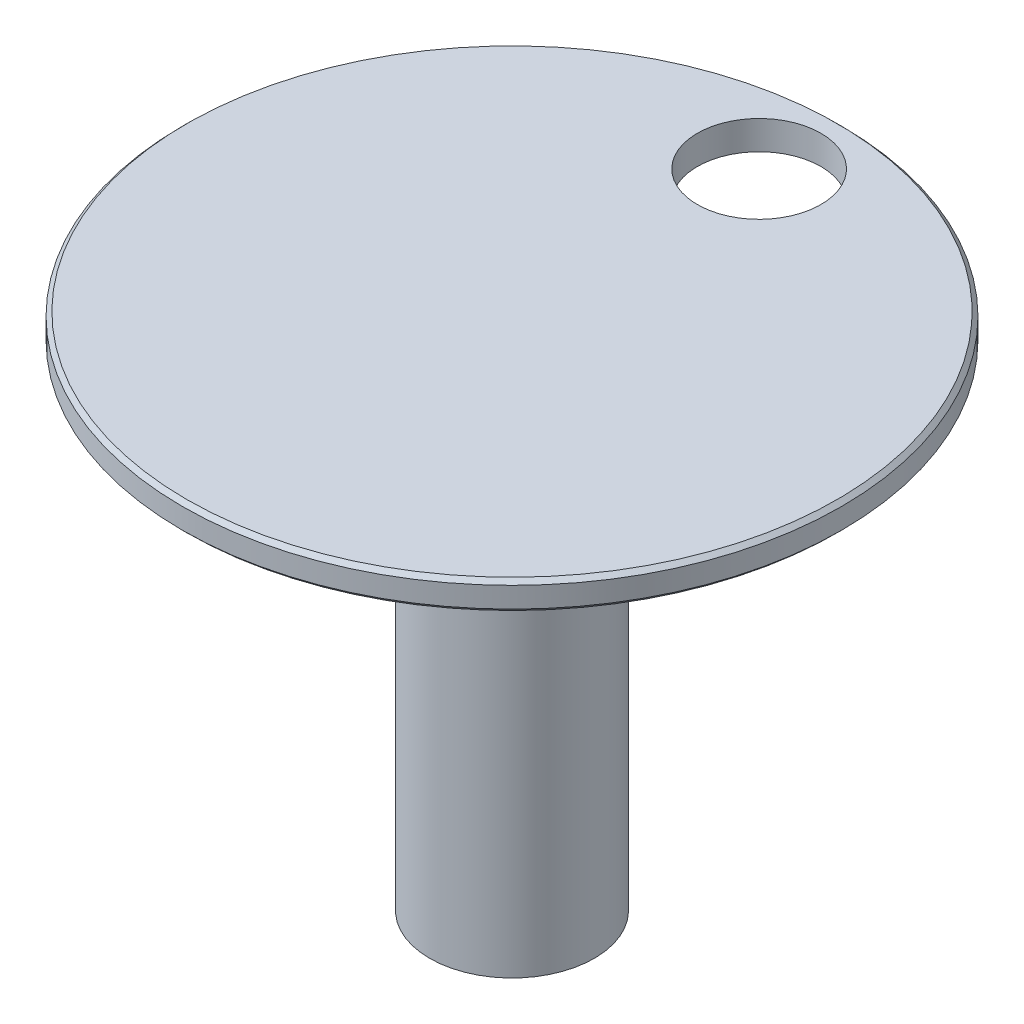
ISO-10303-21;
HEADER;
FILE_DESCRIPTION(('STEP AP214'),'2;1');
FILE_NAME('part.step','',(''),(''),'','','');
FILE_SCHEMA(('AUTOMOTIVE_DESIGN { 1 0 10303 214 1 1 1 1 }'));
ENDSEC;
DATA;
#1=APPLICATION_CONTEXT('core data for automotive mechanical design processes');
#2=APPLICATION_PROTOCOL_DEFINITION('international standard','automotive_design',2000,#1);
#3=PRODUCT_CONTEXT('',#1,'mechanical');
#4=PRODUCT('Part','Part','',(#3));
#5=PRODUCT_RELATED_PRODUCT_CATEGORY('part','',(#4));
#6=PRODUCT_DEFINITION_FORMATION('','',#4);
#7=PRODUCT_DEFINITION_CONTEXT('part definition',#1,'design');
#8=PRODUCT_DEFINITION('design','',#6,#7);
#9=PRODUCT_DEFINITION_SHAPE('','',#8);
#10=(LENGTH_UNIT() NAMED_UNIT(*) SI_UNIT(.MILLI.,.METRE.));
#11=(NAMED_UNIT(*) PLANE_ANGLE_UNIT() SI_UNIT($,.RADIAN.));
#12=(NAMED_UNIT(*) SI_UNIT($,.STERADIAN.) SOLID_ANGLE_UNIT());
#13=UNCERTAINTY_MEASURE_WITH_UNIT(LENGTH_MEASURE(1.E-05),#10,'distance_accuracy_value','');
#14=(GEOMETRIC_REPRESENTATION_CONTEXT(3) GLOBAL_UNCERTAINTY_ASSIGNED_CONTEXT((#13)) GLOBAL_UNIT_ASSIGNED_CONTEXT((#10,
#11,#12)) REPRESENTATION_CONTEXT('',''));
#15=CARTESIAN_POINT('',(0.,0.,0.));
#16=DIRECTION('',(0.,0.,1.));
#17=DIRECTION('',(1.,0.,0.));
#18=AXIS2_PLACEMENT_3D('',#15,#16,#17);
#19=CARTESIAN_POINT('',(0.,11.6,0.));
#20=DIRECTION('',(0.,-1.,0.));
#21=DIRECTION('',(0.,0.,-1.));
#22=AXIS2_PLACEMENT_3D('',#19,#20,#21);
#23=CYLINDRICAL_SURFACE('',#22,2.);
#24=CARTESIAN_POINT('',(0.,11.6,0.));
#25=DIRECTION('',(0.,1.,0.));
#26=DIRECTION('',(0.,0.,1.));
#27=AXIS2_PLACEMENT_3D('',#24,#25,#26);
#28=CIRCLE('',#27,2.);
#29=CARTESIAN_POINT('',(0.,11.6,2.));
#30=VERTEX_POINT('',#29);
#31=EDGE_CURVE('E54',#30,#30,#28,.T.);
#32=ORIENTED_EDGE('',*,*,#31,.F.);
#33=EDGE_LOOP('',(#32));
#34=FACE_BOUND('',#33,.T.);
#35=CARTESIAN_POINT('',(0.,0.,0.));
#36=DIRECTION('',(0.,1.,0.));
#37=DIRECTION('',(0.,0.,1.));
#38=AXIS2_PLACEMENT_3D('',#35,#36,#37);
#39=CIRCLE('',#38,2.);
#40=CARTESIAN_POINT('',(0.,0.,2.));
#41=VERTEX_POINT('',#40);
#42=EDGE_CURVE('E55',#41,#41,#39,.T.);
#43=ORIENTED_EDGE('',*,*,#42,.T.);
#44=EDGE_LOOP('',(#43));
#45=FACE_BOUND('',#44,.T.);
#46=ADVANCED_FACE('F33',(#34,#45),#23,.T.);
#47=CARTESIAN_POINT('',(0.,0.,0.));
#48=DIRECTION('',(0.,1.,0.));
#49=DIRECTION('',(0.,0.,1.));
#50=AXIS2_PLACEMENT_3D('',#47,#48,#49);
#51=PLANE('',#50);
#52=CARTESIAN_POINT('',(0.,0.,0.));
#53=DIRECTION('',(0.,-1.,0.));
#54=DIRECTION('',(0.,0.,-1.));
#55=AXIS2_PLACEMENT_3D('',#52,#53,#54);
#56=CIRCLE('',#55,1.5);
#57=CARTESIAN_POINT('',(0.,0.,-1.5));
#58=VERTEX_POINT('',#57);
#59=EDGE_CURVE('E67',#58,#58,#56,.T.);
#60=ORIENTED_EDGE('',*,*,#59,.F.);
#61=EDGE_LOOP('',(#60));
#62=FACE_BOUND('',#61,.T.);
#63=ORIENTED_EDGE('',*,*,#42,.F.);
#64=EDGE_LOOP('',(#63));
#65=FACE_BOUND('',#64,.T.);
#66=ADVANCED_FACE('F100',(#62,#65),#51,.F.);
#67=CARTESIAN_POINT('',(0.,11.9,0.));
#68=DIRECTION('',(0.,-1.,0.));
#69=DIRECTION('',(0.,0.,-1.));
#70=AXIS2_PLACEMENT_3D('',#67,#68,#69);
#71=CYLINDRICAL_SURFACE('',#70,4.);
#72=CARTESIAN_POINT('',(0.,11.9,0.));
#73=DIRECTION('',(0.,1.,0.));
#74=DIRECTION('',(0.,0.,1.));
#75=AXIS2_PLACEMENT_3D('',#72,#73,#74);
#76=CIRCLE('',#75,4.);
#77=CARTESIAN_POINT('',(0.,11.9,4.));
#78=VERTEX_POINT('',#77);
#79=EDGE_CURVE('E58',#78,#78,#76,.T.);
#80=ORIENTED_EDGE('',*,*,#79,.F.);
#81=EDGE_LOOP('',(#80));
#82=FACE_BOUND('',#81,.T.);
#83=CARTESIAN_POINT('',(0.,11.6,0.));
#84=DIRECTION('',(0.,1.,0.));
#85=DIRECTION('',(0.,0.,1.));
#86=AXIS2_PLACEMENT_3D('',#83,#84,#85);
#87=CIRCLE('',#86,4.);
#88=CARTESIAN_POINT('',(0.,11.6,4.));
#89=VERTEX_POINT('',#88);
#90=EDGE_CURVE('E61',#89,#89,#87,.T.);
#91=ORIENTED_EDGE('',*,*,#90,.T.);
#92=EDGE_LOOP('',(#91));
#93=FACE_BOUND('',#92,.T.);
#94=ADVANCED_FACE('F96',(#82,#93),#71,.T.);
#95=CARTESIAN_POINT('',(0.,11.6,0.));
#96=DIRECTION('',(0.,1.,0.));
#97=DIRECTION('',(0.,0.,1.));
#98=AXIS2_PLACEMENT_3D('',#95,#96,#97);
#99=PLANE('',#98);
#100=ORIENTED_EDGE('',*,*,#31,.T.);
#101=EDGE_LOOP('',(#100));
#102=FACE_BOUND('',#101,.T.);
#103=ORIENTED_EDGE('',*,*,#90,.F.);
#104=EDGE_LOOP('',(#103));
#105=FACE_BOUND('',#104,.T.);
#106=ADVANCED_FACE('F99',(#102,#105),#99,.F.);
#107=CARTESIAN_POINT('',(0.,12.6,0.));
#108=DIRECTION('',(0.,-1.,0.));
#109=DIRECTION('',(0.,0.,-1.));
#110=AXIS2_PLACEMENT_3D('',#107,#108,#109);
#111=CYLINDRICAL_SURFACE('',#110,8.);
#112=CARTESIAN_POINT('',(0.,12.,0.));
#113=DIRECTION('',(0.,1.,0.));
#114=DIRECTION('',(0.,0.,1.));
#115=AXIS2_PLACEMENT_3D('',#112,#113,#114);
#116=CIRCLE('',#115,8.);
#117=CARTESIAN_POINT('',(0.,12.,8.));
#118=VERTEX_POINT('',#117);
#119=EDGE_CURVE('E45',#118,#118,#116,.T.);
#120=ORIENTED_EDGE('',*,*,#119,.T.);
#121=EDGE_LOOP('',(#120));
#122=FACE_BOUND('',#121,.T.);
#123=CARTESIAN_POINT('',(0.,12.5,0.));
#124=DIRECTION('',(0.,1.,0.));
#125=DIRECTION('',(0.,0.,1.));
#126=AXIS2_PLACEMENT_3D('',#123,#124,#125);
#127=CIRCLE('',#126,8.);
#128=CARTESIAN_POINT('',(0.,12.5,8.));
#129=VERTEX_POINT('',#128);
#130=EDGE_CURVE('E49',#129,#129,#127,.F.);
#131=ORIENTED_EDGE('',*,*,#130,.T.);
#132=EDGE_LOOP('',(#131));
#133=FACE_BOUND('',#132,.T.);
#134=ADVANCED_FACE('F105',(#122,#133),#111,.T.);
#135=CARTESIAN_POINT('',(0.,12.6,0.));
#136=DIRECTION('',(0.,1.,0.));
#137=DIRECTION('',(0.,0.,1.));
#138=AXIS2_PLACEMENT_3D('',#135,#136,#137);
#139=PLANE('',#138);
#140=CARTESIAN_POINT('',(0.,12.6,0.));
#141=DIRECTION('',(0.,1.,0.));
#142=DIRECTION('',(0.,0.,1.));
#143=AXIS2_PLACEMENT_3D('',#140,#141,#142);
#144=CIRCLE('',#143,7.9);
#145=CARTESIAN_POINT('',(0.,12.6,7.9));
#146=VERTEX_POINT('',#145);
#147=EDGE_CURVE('E10',#146,#146,#144,.T.);
#148=ORIENTED_EDGE('',*,*,#147,.T.);
#149=EDGE_LOOP('',(#148));
#150=FACE_BOUND('',#149,.T.);
#151=CARTESIAN_POINT('',(0.,12.6,-6.));
#152=DIRECTION('',(0.,-1.,0.));
#153=DIRECTION('',(0.,0.,-1.));
#154=AXIS2_PLACEMENT_3D('',#151,#152,#153);
#155=CIRCLE('',#154,1.5);
#156=CARTESIAN_POINT('',(0.,12.6,-7.5));
#157=VERTEX_POINT('',#156);
#158=EDGE_CURVE('E70',#157,#157,#155,.T.);
#159=ORIENTED_EDGE('',*,*,#158,.T.);
#160=EDGE_LOOP('',(#159));
#161=FACE_BOUND('',#160,.T.);
#162=ADVANCED_FACE('F79',(#150,#161),#139,.T.);
#163=CARTESIAN_POINT('',(0.,11.9,0.));
#164=DIRECTION('',(0.,1.,0.));
#165=DIRECTION('',(0.,0.,1.));
#166=AXIS2_PLACEMENT_3D('',#163,#164,#165);
#167=PLANE('',#166);
#168=CARTESIAN_POINT('',(0.,11.9,0.));
#169=DIRECTION('',(0.,1.,0.));
#170=DIRECTION('',(0.,0.,1.));
#171=AXIS2_PLACEMENT_3D('',#168,#169,#170);
#172=CIRCLE('',#171,7.90000000000001);
#173=CARTESIAN_POINT('',(0.,11.9,7.90000000000001));
#174=VERTEX_POINT('',#173);
#175=EDGE_CURVE('E41',#174,#174,#172,.F.);
#176=ORIENTED_EDGE('',*,*,#175,.T.);
#177=EDGE_LOOP('',(#176));
#178=FACE_BOUND('',#177,.T.);
#179=CARTESIAN_POINT('',(0.,11.9,-6.));
#180=DIRECTION('',(0.,-1.,0.));
#181=DIRECTION('',(0.,0.,-1.));
#182=AXIS2_PLACEMENT_3D('',#179,#180,#181);
#183=CIRCLE('',#182,1.5);
#184=CARTESIAN_POINT('',(0.,11.9,-7.5));
#185=VERTEX_POINT('',#184);
#186=EDGE_CURVE('E73',#185,#185,#183,.T.);
#187=ORIENTED_EDGE('',*,*,#186,.F.);
#188=EDGE_LOOP('',(#187));
#189=FACE_BOUND('',#188,.T.);
#190=ORIENTED_EDGE('',*,*,#79,.T.);
#191=EDGE_LOOP('',(#190));
#192=FACE_BOUND('',#191,.T.);
#193=ADVANCED_FACE('F89',(#178,#189,#192),#167,.F.);
#194=CARTESIAN_POINT('',(0.,8.5,0.));
#195=DIRECTION('',(0.,-1.,0.));
#196=DIRECTION('',(0.,0.,-1.));
#197=AXIS2_PLACEMENT_3D('',#194,#195,#196);
#198=CYLINDRICAL_SURFACE('',#197,1.5);
#199=CARTESIAN_POINT('',(0.,8.5,0.));
#200=DIRECTION('',(0.,-1.,0.));
#201=DIRECTION('',(0.,0.,-1.));
#202=AXIS2_PLACEMENT_3D('',#199,#200,#201);
#203=CIRCLE('',#202,1.5);
#204=CARTESIAN_POINT('',(0.,8.5,-1.5));
#205=VERTEX_POINT('',#204);
#206=EDGE_CURVE('E64',#205,#205,#203,.T.);
#207=ORIENTED_EDGE('',*,*,#206,.F.);
#208=EDGE_LOOP('',(#207));
#209=FACE_BOUND('',#208,.T.);
#210=ORIENTED_EDGE('',*,*,#59,.T.);
#211=EDGE_LOOP('',(#210));
#212=FACE_BOUND('',#211,.T.);
#213=ADVANCED_FACE('F92',(#209,#212),#198,.F.);
#214=CARTESIAN_POINT('',(0.,8.5,0.));
#215=DIRECTION('',(0.,-1.,0.));
#216=DIRECTION('',(0.,0.,-1.));
#217=AXIS2_PLACEMENT_3D('',#214,#215,#216);
#218=PLANE('',#217);
#219=ORIENTED_EDGE('',*,*,#206,.T.);
#220=EDGE_LOOP('',(#219));
#221=FACE_BOUND('',#220,.T.);
#222=ADVANCED_FACE('F85',(#221),#218,.T.);
#223=CARTESIAN_POINT('',(0.,12.6,-6.));
#224=DIRECTION('',(0.,-1.,0.));
#225=DIRECTION('',(0.,0.,-1.));
#226=AXIS2_PLACEMENT_3D('',#223,#224,#225);
#227=CYLINDRICAL_SURFACE('',#226,1.5);
#228=CARTESIAN_POINT('',(0.,12.6,-7.5));
#229=CARTESIAN_POINT('',(0.,12.5927083333333,-7.5));
#230=CARTESIAN_POINT('',(0.,12.5854166666667,-7.5));
#231=CARTESIAN_POINT('',(0.,12.5708333333333,-7.5));
#232=CARTESIAN_POINT('',(0.,12.5635416666667,-7.5));
#233=CARTESIAN_POINT('',(0.,12.5489583333333,-7.5));
#234=CARTESIAN_POINT('',(0.,12.5416666666667,-7.5));
#235=CARTESIAN_POINT('',(0.,12.5270833333333,-7.5));
#236=CARTESIAN_POINT('',(0.,12.5197916666667,-7.5));
#237=CARTESIAN_POINT('',(0.,12.5052083333333,-7.5));
#238=CARTESIAN_POINT('',(0.,12.4979166666667,-7.5));
#239=CARTESIAN_POINT('',(0.,12.4833333333333,-7.5));
#240=CARTESIAN_POINT('',(0.,12.4760416666667,-7.5));
#241=CARTESIAN_POINT('',(0.,12.4614583333333,-7.5));
#242=CARTESIAN_POINT('',(0.,12.4541666666667,-7.5));
#243=CARTESIAN_POINT('',(0.,12.4395833333333,-7.5));
#244=CARTESIAN_POINT('',(0.,12.4322916666667,-7.5));
#245=CARTESIAN_POINT('',(0.,12.4177083333333,-7.5));
#246=CARTESIAN_POINT('',(0.,12.4104166666667,-7.5));
#247=CARTESIAN_POINT('',(0.,12.3958333333333,-7.5));
#248=CARTESIAN_POINT('',(0.,12.3885416666667,-7.5));
#249=CARTESIAN_POINT('',(0.,12.3739583333333,-7.5));
#250=CARTESIAN_POINT('',(0.,12.3666666666667,-7.5));
#251=CARTESIAN_POINT('',(0.,12.3520833333333,-7.5));
#252=CARTESIAN_POINT('',(0.,12.3447916666667,-7.5));
#253=CARTESIAN_POINT('',(0.,12.3302083333333,-7.5));
#254=CARTESIAN_POINT('',(0.,12.3229166666667,-7.5));
#255=CARTESIAN_POINT('',(0.,12.3083333333333,-7.5));
#256=CARTESIAN_POINT('',(0.,12.3010416666667,-7.5));
#257=CARTESIAN_POINT('',(0.,12.2864583333333,-7.5));
#258=CARTESIAN_POINT('',(0.,12.2791666666667,-7.5));
#259=CARTESIAN_POINT('',(0.,12.2645833333333,-7.5));
#260=CARTESIAN_POINT('',(0.,12.2572916666667,-7.5));
#261=CARTESIAN_POINT('',(0.,12.2427083333333,-7.5));
#262=CARTESIAN_POINT('',(0.,12.2354166666667,-7.5));
#263=CARTESIAN_POINT('',(0.,12.2208333333333,-7.5));
#264=CARTESIAN_POINT('',(0.,12.2135416666667,-7.5));
#265=CARTESIAN_POINT('',(0.,12.1989583333333,-7.5));
#266=CARTESIAN_POINT('',(0.,12.1916666666667,-7.5));
#267=CARTESIAN_POINT('',(0.,12.1770833333333,-7.5));
#268=CARTESIAN_POINT('',(0.,12.1697916666667,-7.5));
#269=CARTESIAN_POINT('',(0.,12.1552083333333,-7.5));
#270=CARTESIAN_POINT('',(0.,12.1479166666667,-7.5));
#271=CARTESIAN_POINT('',(0.,12.1333333333333,-7.5));
#272=CARTESIAN_POINT('',(0.,12.1260416666667,-7.5));
#273=CARTESIAN_POINT('',(0.,12.1114583333333,-7.5));
#274=CARTESIAN_POINT('',(0.,12.1041666666667,-7.5));
#275=CARTESIAN_POINT('',(0.,12.0895833333333,-7.5));
#276=CARTESIAN_POINT('',(0.,12.0822916666667,-7.5));
#277=CARTESIAN_POINT('',(0.,12.0677083333333,-7.5));
#278=CARTESIAN_POINT('',(0.,12.0604166666667,-7.5));
#279=CARTESIAN_POINT('',(0.,12.0458333333333,-7.5));
#280=CARTESIAN_POINT('',(0.,12.0385416666667,-7.5));
#281=CARTESIAN_POINT('',(0.,12.0239583333333,-7.5));
#282=CARTESIAN_POINT('',(0.,12.0166666666667,-7.5));
#283=CARTESIAN_POINT('',(0.,12.0020833333333,-7.5));
#284=CARTESIAN_POINT('',(0.,11.9947916666667,-7.5));
#285=CARTESIAN_POINT('',(0.,11.9802083333333,-7.5));
#286=CARTESIAN_POINT('',(0.,11.9729166666667,-7.5));
#287=CARTESIAN_POINT('',(0.,11.9583333333333,-7.5));
#288=CARTESIAN_POINT('',(0.,11.9510416666667,-7.5));
#289=CARTESIAN_POINT('',(0.,11.9364583333333,-7.5));
#290=CARTESIAN_POINT('',(0.,11.9291666666667,-7.5));
#291=CARTESIAN_POINT('',(0.,11.9145833333333,-7.5));
#292=CARTESIAN_POINT('',(0.,11.9072916666667,-7.5));
#293=CARTESIAN_POINT('',(0.,11.9,-7.5));
#294=B_SPLINE_CURVE_WITH_KNOTS('',3,(#228,#229,#230,#231,#232,#233,#234,#235,#236,#237,#238,
#239,#240,#241,#242,#243,#244,#245,#246,#247,#248,#249,#250,#251,#252,#253,#254,#255,#256,#257,
#258,#259,#260,#261,#262,#263,#264,#265,#266,#267,#268,#269,#270,#271,#272,#273,#274,#275,#276,
#277,#278,#279,#280,#281,#282,#283,#284,#285,#286,#287,#288,#289,#290,#291,#292,#293),
.UNSPECIFIED.,.F.,.F.,(4,2,2,2,2,2,2,2,2,2,2,2,2,2,2,2,2,2,2,2,2,2,2,2,2,2,2,2,2,2,2,2,4),(0.,
0.0218750000000011,0.0437500000000004,0.0656250000000014,0.0875000000000008,0.109375,
0.131250000000001,0.153125,0.175000000000002,0.196875000000001,0.21875,0.240625000000001,
0.262500000000001,0.284375,0.306250000000001,0.328125,0.350000000000001,0.371875000000001,
0.39375,0.415625000000001,0.4375,0.459375,0.481250000000001,0.503125,0.525000000000001,0.546875,
0.56875,0.590625000000001,0.6125,0.634374999999999,0.656250000000001,0.678125,
0.700000000000001),.UNSPECIFIED.);
#295=EDGE_CURVE('BSEAM81',#157,#185,#294,.T.);
#296=ORIENTED_EDGE('',*,*,#158,.F.);
#297=ORIENTED_EDGE('',*,*,#186,.T.);
#298=ORIENTED_EDGE('',*,*,#295,.T.);
#299=ORIENTED_EDGE('',*,*,#295,.F.);
#300=EDGE_LOOP('',(#296,#298,#297,#299));
#301=FACE_BOUND('',#300,.T.);
#302=ADVANCED_FACE('F81',(#301),#227,.F.);
#303=CARTESIAN_POINT('',(0.,12.,0.));
#304=DIRECTION('',(0.,1.,0.));
#305=DIRECTION('',(0.,0.,1.));
#306=AXIS2_PLACEMENT_3D('',#303,#304,#305);
#307=CONICAL_SURFACE('',#306,8.,0.78539816339744);
#308=CARTESIAN_POINT('',(0.,11.9,7.90000000000001));
#309=CARTESIAN_POINT('',(0.,11.9010416666667,7.90104166666667));
#310=CARTESIAN_POINT('',(0.,11.9020833333333,7.90208333333334));
#311=CARTESIAN_POINT('',(0.,11.9041666666667,7.90416666666667));
#312=CARTESIAN_POINT('',(0.,11.9052083333333,7.90520833333334));
#313=CARTESIAN_POINT('',(0.,11.9072916666667,7.90729166666667));
#314=CARTESIAN_POINT('',(0.,11.9083333333333,7.90833333333334));
#315=CARTESIAN_POINT('',(0.,11.9104166666667,7.91041666666667));
#316=CARTESIAN_POINT('',(0.,11.9114583333333,7.91145833333334));
#317=CARTESIAN_POINT('',(0.,11.9135416666667,7.91354166666667));
#318=CARTESIAN_POINT('',(0.,11.9145833333333,7.91458333333334));
#319=CARTESIAN_POINT('',(0.,11.9166666666667,7.91666666666667));
#320=CARTESIAN_POINT('',(0.,11.9177083333333,7.91770833333334));
#321=CARTESIAN_POINT('',(0.,11.9197916666667,7.91979166666667));
#322=CARTESIAN_POINT('',(0.,11.9208333333333,7.92083333333334));
#323=CARTESIAN_POINT('',(0.,11.9229166666667,7.92291666666667));
#324=CARTESIAN_POINT('',(0.,11.9239583333333,7.92395833333334));
#325=CARTESIAN_POINT('',(0.,11.9260416666667,7.92604166666667));
#326=CARTESIAN_POINT('',(0.,11.9270833333333,7.92708333333334));
#327=CARTESIAN_POINT('',(0.,11.9291666666667,7.92916666666667));
#328=CARTESIAN_POINT('',(0.,11.9302083333333,7.93020833333334));
#329=CARTESIAN_POINT('',(0.,11.9322916666667,7.93229166666667));
#330=CARTESIAN_POINT('',(0.,11.9333333333333,7.93333333333334));
#331=CARTESIAN_POINT('',(0.,11.9354166666667,7.93541666666667));
#332=CARTESIAN_POINT('',(0.,11.9364583333333,7.93645833333334));
#333=CARTESIAN_POINT('',(0.,11.9385416666667,7.93854166666667));
#334=CARTESIAN_POINT('',(0.,11.9395833333333,7.93958333333334));
#335=CARTESIAN_POINT('',(0.,11.9416666666667,7.94166666666667));
#336=CARTESIAN_POINT('',(0.,11.9427083333333,7.94270833333334));
#337=CARTESIAN_POINT('',(0.,11.9447916666667,7.94479166666667));
#338=CARTESIAN_POINT('',(0.,11.9458333333333,7.94583333333334));
#339=CARTESIAN_POINT('',(0.,11.9479166666667,7.94791666666667));
#340=CARTESIAN_POINT('',(0.,11.9489583333333,7.94895833333334));
#341=CARTESIAN_POINT('',(0.,11.9510416666667,7.95104166666667));
#342=CARTESIAN_POINT('',(0.,11.9520833333333,7.95208333333334));
#343=CARTESIAN_POINT('',(0.,11.9541666666667,7.95416666666667));
#344=CARTESIAN_POINT('',(0.,11.9552083333333,7.95520833333334));
#345=CARTESIAN_POINT('',(0.,11.9572916666667,7.95729166666667));
#346=CARTESIAN_POINT('',(0.,11.9583333333333,7.95833333333334));
#347=CARTESIAN_POINT('',(0.,11.9604166666667,7.96041666666667));
#348=CARTESIAN_POINT('',(0.,11.9614583333333,7.96145833333334));
#349=CARTESIAN_POINT('',(0.,11.9635416666667,7.96354166666667));
#350=CARTESIAN_POINT('',(0.,11.9645833333333,7.96458333333334));
#351=CARTESIAN_POINT('',(0.,11.9666666666667,7.96666666666667));
#352=CARTESIAN_POINT('',(0.,11.9677083333333,7.96770833333334));
#353=CARTESIAN_POINT('',(0.,11.9697916666667,7.96979166666667));
#354=CARTESIAN_POINT('',(0.,11.9708333333333,7.97083333333333));
#355=CARTESIAN_POINT('',(0.,11.9729166666667,7.97291666666667));
#356=CARTESIAN_POINT('',(0.,11.9739583333333,7.97395833333333));
#357=CARTESIAN_POINT('',(0.,11.9760416666667,7.97604166666667));
#358=CARTESIAN_POINT('',(0.,11.9770833333333,7.97708333333333));
#359=CARTESIAN_POINT('',(0.,11.9791666666667,7.97916666666667));
#360=CARTESIAN_POINT('',(0.,11.9802083333333,7.98020833333333));
#361=CARTESIAN_POINT('',(0.,11.9822916666667,7.98229166666667));
#362=CARTESIAN_POINT('',(0.,11.9833333333333,7.98333333333333));
#363=CARTESIAN_POINT('',(0.,11.9854166666667,7.98541666666667));
#364=CARTESIAN_POINT('',(0.,11.9864583333333,7.98645833333333));
#365=CARTESIAN_POINT('',(0.,11.9885416666667,7.98854166666667));
#366=CARTESIAN_POINT('',(0.,11.9895833333333,7.98958333333333));
#367=CARTESIAN_POINT('',(0.,11.9916666666667,7.99166666666667));
#368=CARTESIAN_POINT('',(0.,11.9927083333333,7.99270833333333));
#369=CARTESIAN_POINT('',(0.,11.9947916666667,7.99479166666667));
#370=CARTESIAN_POINT('',(0.,11.9958333333333,7.99583333333333));
#371=CARTESIAN_POINT('',(0.,11.9979166666667,7.99791666666667));
#372=CARTESIAN_POINT('',(0.,11.9989583333333,7.99895833333333));
#373=CARTESIAN_POINT('',(0.,12.,8.));
#374=B_SPLINE_CURVE_WITH_KNOTS('',3,(#308,#309,#310,#311,#312,#313,#314,#315,#316,#317,#318,
#319,#320,#321,#322,#323,#324,#325,#326,#327,#328,#329,#330,#331,#332,#333,#334,#335,#336,#337,
#338,#339,#340,#341,#342,#343,#344,#345,#346,#347,#348,#349,#350,#351,#352,#353,#354,#355,#356,
#357,#358,#359,#360,#361,#362,#363,#364,#365,#366,#367,#368,#369,#370,#371,#372,#373),
.UNSPECIFIED.,.F.,.F.,(4,2,2,2,2,2,2,2,2,2,2,2,2,2,2,2,2,2,2,2,2,2,2,2,2,2,2,2,2,2,2,2,4),(0.,
0.00441941738241544,0.00883883476483087,0.0132582521472463,0.0176776695296617,
0.0220970869120772,0.0265165042944926,0.030935921676908,0.0353553390593235,0.0397747564417389,
0.0441941738241543,0.048613591206571,0.0530330085889864,0.0574524259714019,0.0618718433538173,
0.0662912607362327,0.0707106781186482,0.0751300955010648,0.0795495128834803,0.0839689302658957,
0.0883883476483112,0.0928077650307266,0.0972271824131433,0.101646599795559,0.106066017177974,
0.11048543456039,0.114904851942805,0.11932426932522,0.123743686707636,0.128163104090051,
0.132582521472467,0.137001938854882,0.1414213562373),.UNSPECIFIED.);
#375=EDGE_CURVE('BSEAM84',#174,#118,#374,.T.);
#376=ORIENTED_EDGE('',*,*,#175,.F.);
#377=ORIENTED_EDGE('',*,*,#119,.F.);
#378=ORIENTED_EDGE('',*,*,#375,.T.);
#379=ORIENTED_EDGE('',*,*,#375,.F.);
#380=EDGE_LOOP('',(#376,#378,#377,#379));
#381=FACE_BOUND('',#380,.T.);
#382=ADVANCED_FACE('F84',(#381),#307,.T.);
#383=CARTESIAN_POINT('',(0.,12.6,0.));
#384=DIRECTION('',(0.,-1.,0.));
#385=DIRECTION('',(0.,0.,-1.));
#386=AXIS2_PLACEMENT_3D('',#383,#384,#385);
#387=CONICAL_SURFACE('',#386,7.9,0.78539816339744);
#388=ORIENTED_EDGE('',*,*,#130,.F.);
#389=EDGE_LOOP('',(#388));
#390=FACE_BOUND('',#389,.T.);
#391=ORIENTED_EDGE('',*,*,#147,.F.);
#392=EDGE_LOOP('',(#391));
#393=FACE_BOUND('',#392,.T.);
#394=ADVANCED_FACE('F36',(#390,#393),#387,.T.);
#395=CLOSED_SHELL('',(#46,#66,#94,#106,#134,#162,#193,#213,#222,#302,#382,#394));
#396=MANIFOLD_SOLID_BREP('B2',#395);
#397=ADVANCED_BREP_SHAPE_REPRESENTATION('',(#18,#396),#14);
#398=SHAPE_DEFINITION_REPRESENTATION(#9,#397);
ENDSEC;
END-ISO-10303-21;
